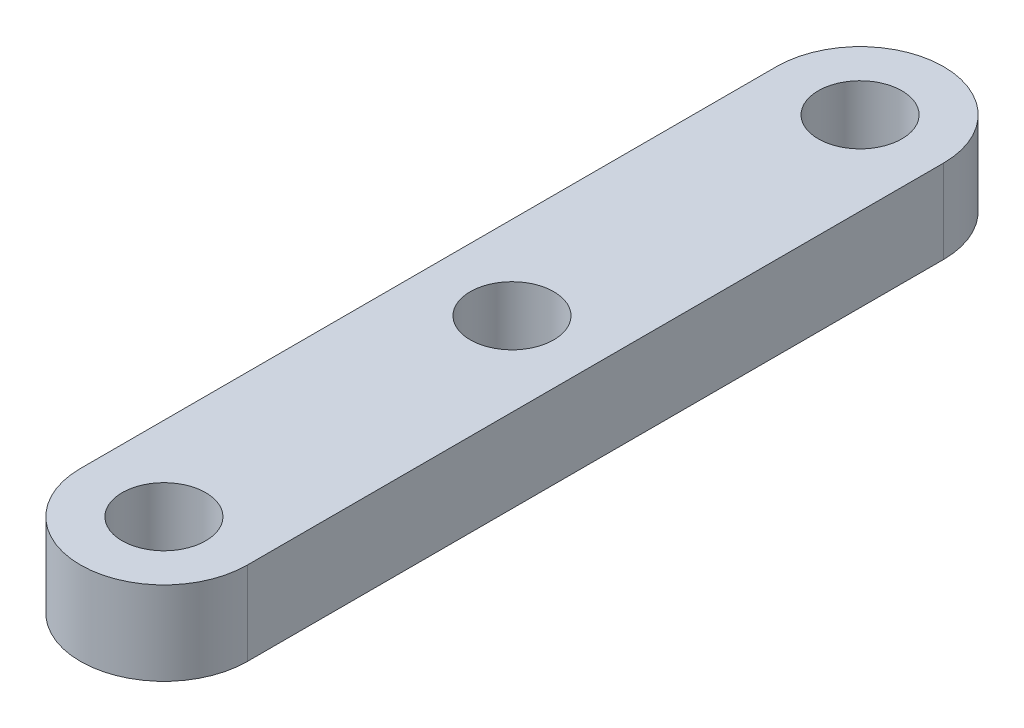
ISO-10303-21;
HEADER;
FILE_DESCRIPTION(('STEP AP214'),'2;1');
FILE_NAME('part.step','',(''),(''),'','','');
FILE_SCHEMA(('AUTOMOTIVE_DESIGN { 1 0 10303 214 1 1 1 1 }'));
ENDSEC;
DATA;
#1=APPLICATION_CONTEXT('core data for automotive mechanical design processes');
#2=APPLICATION_PROTOCOL_DEFINITION('international standard','automotive_design',2000,#1);
#3=PRODUCT_CONTEXT('',#1,'mechanical');
#4=PRODUCT('Part','Part','',(#3));
#5=PRODUCT_RELATED_PRODUCT_CATEGORY('part','',(#4));
#6=PRODUCT_DEFINITION_FORMATION('','',#4);
#7=PRODUCT_DEFINITION_CONTEXT('part definition',#1,'design');
#8=PRODUCT_DEFINITION('design','',#6,#7);
#9=PRODUCT_DEFINITION_SHAPE('','',#8);
#10=(LENGTH_UNIT() NAMED_UNIT(*) SI_UNIT(.MILLI.,.METRE.));
#11=(NAMED_UNIT(*) PLANE_ANGLE_UNIT() SI_UNIT($,.RADIAN.));
#12=(NAMED_UNIT(*) SI_UNIT($,.STERADIAN.) SOLID_ANGLE_UNIT());
#13=UNCERTAINTY_MEASURE_WITH_UNIT(LENGTH_MEASURE(1.E-05),#10,'distance_accuracy_value','');
#14=(GEOMETRIC_REPRESENTATION_CONTEXT(3) GLOBAL_UNCERTAINTY_ASSIGNED_CONTEXT((#13)) GLOBAL_UNIT_ASSIGNED_CONTEXT((#10,
#11,#12)) REPRESENTATION_CONTEXT('',''));
#15=CARTESIAN_POINT('',(0.,0.,0.));
#16=DIRECTION('',(0.,0.,1.));
#17=DIRECTION('',(1.,0.,0.));
#18=AXIS2_PLACEMENT_3D('',#15,#16,#17);
#19=CARTESIAN_POINT('',(0.,3.,-12.5));
#20=DIRECTION('',(0.,-1.,0.));
#21=DIRECTION('',(0.,0.,-1.));
#22=AXIS2_PLACEMENT_3D('',#19,#20,#21);
#23=PLANE('',#22);
#24=CARTESIAN_POINT('',(0.,3.,-12.5));
#25=DIRECTION('',(0.,1.,0.));
#26=DIRECTION('',(0.,0.,-1.));
#27=AXIS2_PLACEMENT_3D('',#24,#25,#26);
#28=CIRCLE('',#27,3.);
#29=CARTESIAN_POINT('',(3.,3.,-12.5));
#30=VERTEX_POINT('',#29);
#31=CARTESIAN_POINT('',(-3.,3.,-12.5));
#32=VERTEX_POINT('',#31);
#33=EDGE_CURVE('E85',#30,#32,#28,.T.);
#34=ORIENTED_EDGE('',*,*,#33,.T.);
#35=DIRECTION('',(0.,0.,1.));
#36=VECTOR('',#35,1.);
#37=CARTESIAN_POINT('',(-3.,3.,-12.5));
#38=LINE('',#37,#36);
#39=CARTESIAN_POINT('',(-3.,3.,12.5));
#40=VERTEX_POINT('',#39);
#41=EDGE_CURVE('E80',#32,#40,#38,.T.);
#42=ORIENTED_EDGE('',*,*,#41,.T.);
#43=CARTESIAN_POINT('',(0.,3.,12.5));
#44=DIRECTION('',(0.,1.,0.));
#45=DIRECTION('',(0.,0.,1.));
#46=AXIS2_PLACEMENT_3D('',#43,#44,#45);
#47=CIRCLE('',#46,3.);
#48=CARTESIAN_POINT('',(3.,3.,12.5));
#49=VERTEX_POINT('',#48);
#50=EDGE_CURVE('E83',#40,#49,#47,.T.);
#51=ORIENTED_EDGE('',*,*,#50,.T.);
#52=DIRECTION('',(0.,0.,-1.));
#53=VECTOR('',#52,1.);
#54=CARTESIAN_POINT('',(3.,3.,-12.5));
#55=LINE('',#54,#53);
#56=EDGE_CURVE('E50',#49,#30,#55,.T.);
#57=ORIENTED_EDGE('',*,*,#56,.T.);
#58=EDGE_LOOP('',(#34,#42,#51,#57));
#59=FACE_BOUND('',#58,.T.);
#60=CARTESIAN_POINT('',(0.,3.,-12.5));
#61=DIRECTION('',(0.,1.,0.));
#62=DIRECTION('',(0.,0.,1.));
#63=AXIS2_PLACEMENT_3D('',#60,#61,#62);
#64=CIRCLE('',#63,1.5);
#65=CARTESIAN_POINT('',(0.,3.,-11.));
#66=VERTEX_POINT('',#65);
#67=EDGE_CURVE('E100',#66,#66,#64,.T.);
#68=ORIENTED_EDGE('',*,*,#67,.F.);
#69=EDGE_LOOP('',(#68));
#70=FACE_BOUND('',#69,.T.);
#71=CARTESIAN_POINT('',(0.,3.,0.));
#72=DIRECTION('',(0.,1.,0.));
#73=DIRECTION('',(0.,0.,1.));
#74=AXIS2_PLACEMENT_3D('',#71,#72,#73);
#75=CIRCLE('',#74,1.5);
#76=CARTESIAN_POINT('',(0.,3.,1.5));
#77=VERTEX_POINT('',#76);
#78=EDGE_CURVE('E115',#77,#77,#75,.T.);
#79=ORIENTED_EDGE('',*,*,#78,.F.);
#80=EDGE_LOOP('',(#79));
#81=FACE_BOUND('',#80,.T.);
#82=CARTESIAN_POINT('',(0.,3.,12.5));
#83=DIRECTION('',(0.,1.,0.));
#84=DIRECTION('',(0.,0.,1.));
#85=AXIS2_PLACEMENT_3D('',#82,#83,#84);
#86=CIRCLE('',#85,1.5);
#87=CARTESIAN_POINT('',(0.,3.,14.));
#88=VERTEX_POINT('',#87);
#89=EDGE_CURVE('E121',#88,#88,#86,.T.);
#90=ORIENTED_EDGE('',*,*,#89,.F.);
#91=EDGE_LOOP('',(#90));
#92=FACE_BOUND('',#91,.T.);
#93=ADVANCED_FACE('F33',(#59,#70,#81,#92),#23,.F.);
#94=CARTESIAN_POINT('',(0.,0.,-12.5));
#95=DIRECTION('',(0.,-1.,0.));
#96=DIRECTION('',(0.,0.,-1.));
#97=AXIS2_PLACEMENT_3D('',#94,#95,#96);
#98=PLANE('',#97);
#99=CARTESIAN_POINT('',(0.,0.,0.));
#100=DIRECTION('',(0.,1.,0.));
#101=DIRECTION('',(0.,0.,1.));
#102=AXIS2_PLACEMENT_3D('',#99,#100,#101);
#103=CIRCLE('',#102,1.5);
#104=CARTESIAN_POINT('',(0.,0.,1.5));
#105=VERTEX_POINT('',#104);
#106=EDGE_CURVE('E118',#105,#105,#103,.T.);
#107=ORIENTED_EDGE('',*,*,#106,.T.);
#108=EDGE_LOOP('',(#107));
#109=FACE_BOUND('',#108,.T.);
#110=CARTESIAN_POINT('',(0.,0.,-12.5));
#111=DIRECTION('',(0.,1.,0.));
#112=DIRECTION('',(0.,0.,-1.));
#113=AXIS2_PLACEMENT_3D('',#110,#111,#112);
#114=CIRCLE('',#113,3.);
#115=CARTESIAN_POINT('',(3.,0.,-12.5));
#116=VERTEX_POINT('',#115);
#117=CARTESIAN_POINT('',(-3.,0.,-12.5));
#118=VERTEX_POINT('',#117);
#119=EDGE_CURVE('E97',#116,#118,#114,.T.);
#120=ORIENTED_EDGE('',*,*,#119,.F.);
#121=DIRECTION('',(0.,0.,-1.));
#122=VECTOR('',#121,1.);
#123=CARTESIAN_POINT('',(3.,0.,-12.5));
#124=LINE('',#123,#122);
#125=CARTESIAN_POINT('',(3.,0.,12.5));
#126=VERTEX_POINT('',#125);
#127=EDGE_CURVE('E73',#126,#116,#124,.T.);
#128=ORIENTED_EDGE('',*,*,#127,.F.);
#129=CARTESIAN_POINT('',(0.,0.,12.5));
#130=DIRECTION('',(0.,1.,0.));
#131=DIRECTION('',(0.,0.,1.));
#132=AXIS2_PLACEMENT_3D('',#129,#130,#131);
#133=CIRCLE('',#132,3.);
#134=CARTESIAN_POINT('',(-3.,0.,12.5));
#135=VERTEX_POINT('',#134);
#136=EDGE_CURVE('E67',#135,#126,#133,.T.);
#137=ORIENTED_EDGE('',*,*,#136,.F.);
#138=DIRECTION('',(0.,0.,1.));
#139=VECTOR('',#138,1.);
#140=CARTESIAN_POINT('',(-3.,0.,-12.5));
#141=LINE('',#140,#139);
#142=EDGE_CURVE('E89',#118,#135,#141,.T.);
#143=ORIENTED_EDGE('',*,*,#142,.F.);
#144=EDGE_LOOP('',(#120,#128,#137,#143));
#145=FACE_BOUND('',#144,.T.);
#146=CARTESIAN_POINT('',(0.,0.,-12.5));
#147=DIRECTION('',(0.,1.,0.));
#148=DIRECTION('',(0.,0.,1.));
#149=AXIS2_PLACEMENT_3D('',#146,#147,#148);
#150=CIRCLE('',#149,1.5);
#151=CARTESIAN_POINT('',(0.,0.,-11.));
#152=VERTEX_POINT('',#151);
#153=EDGE_CURVE('E112',#152,#152,#150,.T.);
#154=ORIENTED_EDGE('',*,*,#153,.T.);
#155=EDGE_LOOP('',(#154));
#156=FACE_BOUND('',#155,.T.);
#157=CARTESIAN_POINT('',(0.,0.,12.5));
#158=DIRECTION('',(0.,1.,0.));
#159=DIRECTION('',(0.,0.,1.));
#160=AXIS2_PLACEMENT_3D('',#157,#158,#159);
#161=CIRCLE('',#160,1.5);
#162=CARTESIAN_POINT('',(0.,0.,14.));
#163=VERTEX_POINT('',#162);
#164=EDGE_CURVE('E124',#163,#163,#161,.T.);
#165=ORIENTED_EDGE('',*,*,#164,.T.);
#166=EDGE_LOOP('',(#165));
#167=FACE_BOUND('',#166,.T.);
#168=ADVANCED_FACE('F108',(#109,#145,#156,#167),#98,.T.);
#169=CARTESIAN_POINT('',(0.,3.,-12.5));
#170=DIRECTION('',(0.,-1.,0.));
#171=DIRECTION('',(0.,0.,-1.));
#172=AXIS2_PLACEMENT_3D('',#169,#170,#171);
#173=CYLINDRICAL_SURFACE('',#172,3.);
#174=ORIENTED_EDGE('',*,*,#119,.T.);
#175=DIRECTION('',(0.,-1.,0.));
#176=VECTOR('',#175,1.);
#177=CARTESIAN_POINT('',(-3.,3.,-12.5));
#178=LINE('',#177,#176);
#179=EDGE_CURVE('E11',#32,#118,#178,.T.);
#180=ORIENTED_EDGE('',*,*,#179,.F.);
#181=ORIENTED_EDGE('',*,*,#33,.F.);
#182=DIRECTION('',(0.,-1.,0.));
#183=VECTOR('',#182,1.);
#184=CARTESIAN_POINT('',(3.,3.,-12.5));
#185=LINE('',#184,#183);
#186=EDGE_CURVE('E93',#30,#116,#185,.T.);
#187=ORIENTED_EDGE('',*,*,#186,.T.);
#188=EDGE_LOOP('',(#174,#180,#181,#187));
#189=FACE_BOUND('',#188,.T.);
#190=ADVANCED_FACE('F35',(#189),#173,.T.);
#191=CARTESIAN_POINT('',(-3.,3.,-12.5));
#192=DIRECTION('',(1.,0.,0.));
#193=DIRECTION('',(0.,0.,-1.));
#194=AXIS2_PLACEMENT_3D('',#191,#192,#193);
#195=PLANE('',#194);
#196=ORIENTED_EDGE('',*,*,#142,.T.);
#197=DIRECTION('',(0.,-1.,0.));
#198=VECTOR('',#197,1.);
#199=CARTESIAN_POINT('',(-3.,3.,12.5));
#200=LINE('',#199,#198);
#201=EDGE_CURVE('E42',#40,#135,#200,.T.);
#202=ORIENTED_EDGE('',*,*,#201,.F.);
#203=ORIENTED_EDGE('',*,*,#41,.F.);
#204=ORIENTED_EDGE('',*,*,#179,.T.);
#205=EDGE_LOOP('',(#196,#202,#203,#204));
#206=FACE_BOUND('',#205,.T.);
#207=ADVANCED_FACE('F88',(#206),#195,.F.);
#208=CARTESIAN_POINT('',(0.,3.,12.5));
#209=DIRECTION('',(0.,-1.,0.));
#210=DIRECTION('',(0.,0.,-1.));
#211=AXIS2_PLACEMENT_3D('',#208,#209,#210);
#212=CYLINDRICAL_SURFACE('',#211,3.);
#213=ORIENTED_EDGE('',*,*,#136,.T.);
#214=DIRECTION('',(0.,-1.,0.));
#215=VECTOR('',#214,1.);
#216=CARTESIAN_POINT('',(3.,3.,12.5));
#217=LINE('',#216,#215);
#218=EDGE_CURVE('E90',#49,#126,#217,.T.);
#219=ORIENTED_EDGE('',*,*,#218,.F.);
#220=ORIENTED_EDGE('',*,*,#50,.F.);
#221=ORIENTED_EDGE('',*,*,#201,.T.);
#222=EDGE_LOOP('',(#213,#219,#220,#221));
#223=FACE_BOUND('',#222,.T.);
#224=ADVANCED_FACE('F91',(#223),#212,.T.);
#225=CARTESIAN_POINT('',(3.,3.,-12.5));
#226=DIRECTION('',(-1.,0.,0.));
#227=DIRECTION('',(0.,0.,1.));
#228=AXIS2_PLACEMENT_3D('',#225,#226,#227);
#229=PLANE('',#228);
#230=ORIENTED_EDGE('',*,*,#127,.T.);
#231=ORIENTED_EDGE('',*,*,#186,.F.);
#232=ORIENTED_EDGE('',*,*,#56,.F.);
#233=ORIENTED_EDGE('',*,*,#218,.T.);
#234=EDGE_LOOP('',(#230,#231,#232,#233));
#235=FACE_BOUND('',#234,.T.);
#236=ADVANCED_FACE('F105',(#235),#229,.F.);
#237=CARTESIAN_POINT('',(0.,3.,-12.5));
#238=DIRECTION('',(0.,-1.,0.));
#239=DIRECTION('',(0.,0.,-1.));
#240=AXIS2_PLACEMENT_3D('',#237,#238,#239);
#241=CYLINDRICAL_SURFACE('',#240,1.5);
#242=ORIENTED_EDGE('',*,*,#67,.T.);
#243=EDGE_LOOP('',(#242));
#244=FACE_BOUND('',#243,.T.);
#245=ORIENTED_EDGE('',*,*,#153,.F.);
#246=EDGE_LOOP('',(#245));
#247=FACE_BOUND('',#246,.T.);
#248=ADVANCED_FACE('F141',(#244,#247),#241,.F.);
#249=CARTESIAN_POINT('',(0.,3.,0.));
#250=DIRECTION('',(0.,-1.,0.));
#251=DIRECTION('',(0.,0.,-1.));
#252=AXIS2_PLACEMENT_3D('',#249,#250,#251);
#253=CYLINDRICAL_SURFACE('',#252,1.5);
#254=ORIENTED_EDGE('',*,*,#78,.T.);
#255=EDGE_LOOP('',(#254));
#256=FACE_BOUND('',#255,.T.);
#257=ORIENTED_EDGE('',*,*,#106,.F.);
#258=EDGE_LOOP('',(#257));
#259=FACE_BOUND('',#258,.T.);
#260=ADVANCED_FACE('F187',(#256,#259),#253,.F.);
#261=CARTESIAN_POINT('',(0.,3.,12.5));
#262=DIRECTION('',(0.,-1.,0.));
#263=DIRECTION('',(0.,0.,-1.));
#264=AXIS2_PLACEMENT_3D('',#261,#262,#263);
#265=CYLINDRICAL_SURFACE('',#264,1.5);
#266=ORIENTED_EDGE('',*,*,#89,.T.);
#267=EDGE_LOOP('',(#266));
#268=FACE_BOUND('',#267,.T.);
#269=ORIENTED_EDGE('',*,*,#164,.F.);
#270=EDGE_LOOP('',(#269));
#271=FACE_BOUND('',#270,.T.);
#272=ADVANCED_FACE('F130',(#268,#271),#265,.F.);
#273=CLOSED_SHELL('',(#93,#168,#190,#207,#224,#236,#248,#260,#272));
#274=MANIFOLD_SOLID_BREP('B2',#273);
#275=ADVANCED_BREP_SHAPE_REPRESENTATION('',(#18,#274),#14);
#276=SHAPE_DEFINITION_REPRESENTATION(#9,#275);
ENDSEC;
END-ISO-10303-21;
